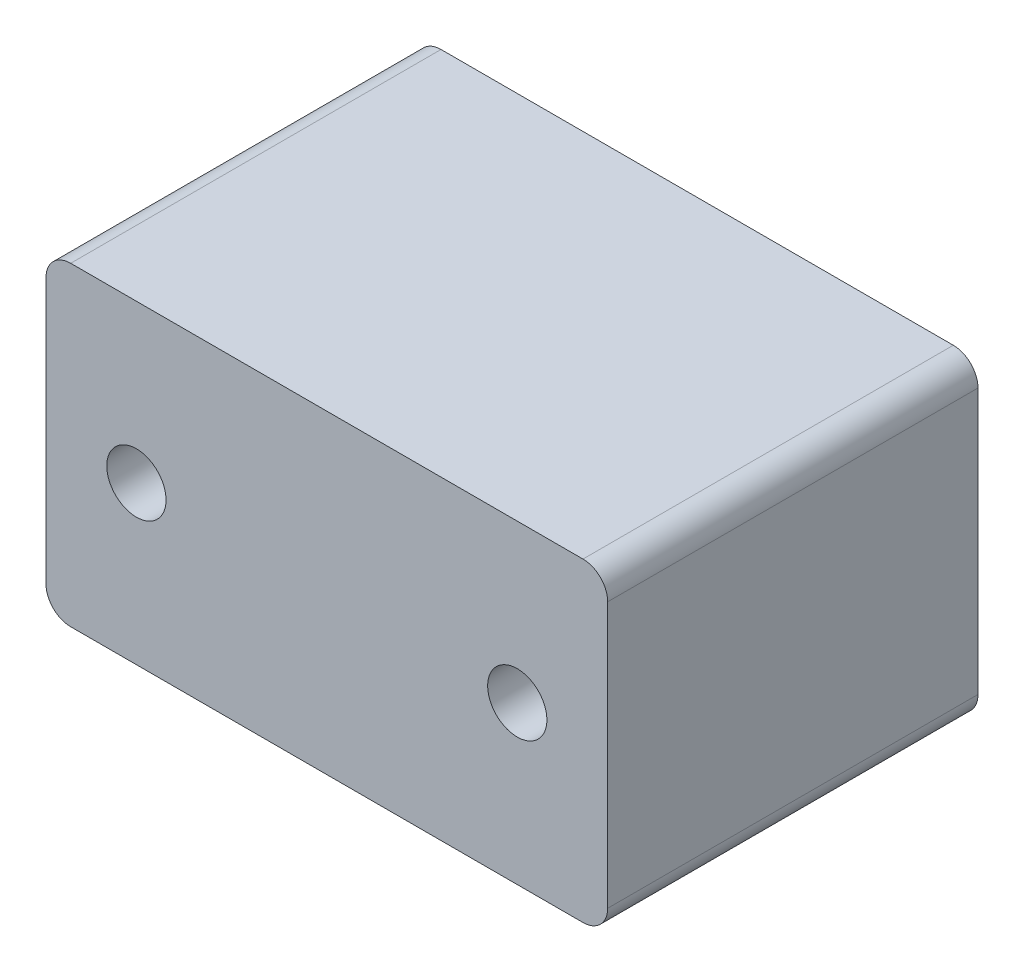
ISO-10303-21;
HEADER;
FILE_DESCRIPTION(('STEP AP214'),'2;1');
FILE_NAME('part.step','',(''),(''),'','','');
FILE_SCHEMA(('AUTOMOTIVE_DESIGN { 1 0 10303 214 1 1 1 1 }'));
ENDSEC;
DATA;
#1=APPLICATION_CONTEXT('core data for automotive mechanical design processes');
#2=APPLICATION_PROTOCOL_DEFINITION('international standard','automotive_design',2000,#1);
#3=PRODUCT_CONTEXT('',#1,'mechanical');
#4=PRODUCT('Part','Part','',(#3));
#5=PRODUCT_RELATED_PRODUCT_CATEGORY('part','',(#4));
#6=PRODUCT_DEFINITION_FORMATION('','',#4);
#7=PRODUCT_DEFINITION_CONTEXT('part definition',#1,'design');
#8=PRODUCT_DEFINITION('design','',#6,#7);
#9=PRODUCT_DEFINITION_SHAPE('','',#8);
#10=(LENGTH_UNIT() NAMED_UNIT(*) SI_UNIT(.MILLI.,.METRE.));
#11=(NAMED_UNIT(*) PLANE_ANGLE_UNIT() SI_UNIT($,.RADIAN.));
#12=(NAMED_UNIT(*) SI_UNIT($,.STERADIAN.) SOLID_ANGLE_UNIT());
#13=UNCERTAINTY_MEASURE_WITH_UNIT(LENGTH_MEASURE(1.E-05),#10,'distance_accuracy_value','');
#14=(GEOMETRIC_REPRESENTATION_CONTEXT(3) GLOBAL_UNCERTAINTY_ASSIGNED_CONTEXT((#13)) GLOBAL_UNIT_ASSIGNED_CONTEXT((#10,
#11,#12)) REPRESENTATION_CONTEXT('',''));
#15=CARTESIAN_POINT('',(0.,0.,0.));
#16=DIRECTION('',(0.,0.,1.));
#17=DIRECTION('',(1.,0.,0.));
#18=AXIS2_PLACEMENT_3D('',#15,#16,#17);
#19=CARTESIAN_POINT('',(0.,0.,15.));
#20=DIRECTION('',(0.,0.,1.));
#21=DIRECTION('',(1.,0.,0.));
#22=AXIS2_PLACEMENT_3D('',#19,#20,#21);
#23=PLANE('',#22);
#24=CARTESIAN_POINT('',(-15.4263698630137,0.,15.));
#25=DIRECTION('',(0.,0.,1.));
#26=DIRECTION('',(1.,0.,0.));
#27=AXIS2_PLACEMENT_3D('',#24,#25,#26);
#28=CIRCLE('',#27,2.4);
#29=CARTESIAN_POINT('',(-13.0263698630137,0.,15.));
#30=VERTEX_POINT('',#29);
#31=EDGE_CURVE('E147',#30,#30,#28,.T.);
#32=ORIENTED_EDGE('',*,*,#31,.F.);
#33=EDGE_LOOP('',(#32));
#34=FACE_BOUND('',#33,.T.);
#35=DIRECTION('',(0.,-1.,0.));
#36=VECTOR('',#35,1.);
#37=CARTESIAN_POINT('',(-22.75,-12.75,15.));
#38=LINE('',#37,#36);
#39=CARTESIAN_POINT('',(-22.75,10.75,15.));
#40=VERTEX_POINT('',#39);
#41=CARTESIAN_POINT('',(-22.75,-10.75,15.));
#42=VERTEX_POINT('',#41);
#43=EDGE_CURVE('E153',#40,#42,#38,.T.);
#44=ORIENTED_EDGE('',*,*,#43,.T.);
#45=CARTESIAN_POINT('',(-20.75,-10.75,15.));
#46=DIRECTION('',(0.,0.,1.));
#47=DIRECTION('',(1.,0.,0.));
#48=AXIS2_PLACEMENT_3D('',#45,#46,#47);
#49=CIRCLE('',#48,2.);
#50=CARTESIAN_POINT('',(-20.75,-12.75,15.));
#51=VERTEX_POINT('',#50);
#52=EDGE_CURVE('E177',#42,#51,#49,.T.);
#53=ORIENTED_EDGE('',*,*,#52,.T.);
#54=DIRECTION('',(1.,0.,0.));
#55=VECTOR('',#54,1.);
#56=CARTESIAN_POINT('',(22.75,-12.75,15.));
#57=LINE('',#56,#55);
#58=CARTESIAN_POINT('',(20.75,-12.75,15.));
#59=VERTEX_POINT('',#58);
#60=EDGE_CURVE('E130',#51,#59,#57,.T.);
#61=ORIENTED_EDGE('',*,*,#60,.T.);
#62=CARTESIAN_POINT('',(20.75,-10.75,15.));
#63=DIRECTION('',(0.,0.,1.));
#64=DIRECTION('',(1.,0.,0.));
#65=AXIS2_PLACEMENT_3D('',#62,#63,#64);
#66=CIRCLE('',#65,2.);
#67=CARTESIAN_POINT('',(22.75,-10.75,15.));
#68=VERTEX_POINT('',#67);
#69=EDGE_CURVE('E174',#59,#68,#66,.T.);
#70=ORIENTED_EDGE('',*,*,#69,.T.);
#71=DIRECTION('',(0.,1.,0.));
#72=VECTOR('',#71,1.);
#73=CARTESIAN_POINT('',(22.75,-12.75,15.));
#74=LINE('',#73,#72);
#75=CARTESIAN_POINT('',(22.75,10.75,15.));
#76=VERTEX_POINT('',#75);
#77=EDGE_CURVE('E203',#68,#76,#74,.T.);
#78=ORIENTED_EDGE('',*,*,#77,.T.);
#79=CARTESIAN_POINT('',(20.75,10.75,15.));
#80=DIRECTION('',(0.,0.,1.));
#81=DIRECTION('',(1.,0.,0.));
#82=AXIS2_PLACEMENT_3D('',#79,#80,#81);
#83=CIRCLE('',#82,2.);
#84=CARTESIAN_POINT('',(20.75,12.75,15.));
#85=VERTEX_POINT('',#84);
#86=EDGE_CURVE('E64',#76,#85,#83,.T.);
#87=ORIENTED_EDGE('',*,*,#86,.T.);
#88=DIRECTION('',(-1.,0.,0.));
#89=VECTOR('',#88,1.);
#90=CARTESIAN_POINT('',(22.75,12.75,15.));
#91=LINE('',#90,#89);
#92=CARTESIAN_POINT('',(-20.75,12.75,15.));
#93=VERTEX_POINT('',#92);
#94=EDGE_CURVE('E155',#85,#93,#91,.T.);
#95=ORIENTED_EDGE('',*,*,#94,.T.);
#96=CARTESIAN_POINT('',(-20.75,10.75,15.));
#97=DIRECTION('',(0.,0.,1.));
#98=DIRECTION('',(1.,0.,0.));
#99=AXIS2_PLACEMENT_3D('',#96,#97,#98);
#100=CIRCLE('',#99,2.);
#101=EDGE_CURVE('E171',#93,#40,#100,.T.);
#102=ORIENTED_EDGE('',*,*,#101,.T.);
#103=EDGE_LOOP('',(#44,#53,#61,#70,#78,#87,#95,#102));
#104=FACE_BOUND('',#103,.T.);
#105=CARTESIAN_POINT('',(15.4263698630137,0.,15.));
#106=DIRECTION('',(0.,0.,1.));
#107=DIRECTION('',(-1.,0.,0.));
#108=AXIS2_PLACEMENT_3D('',#105,#106,#107);
#109=CIRCLE('',#108,2.4);
#110=CARTESIAN_POINT('',(13.0263698630137,0.,15.));
#111=VERTEX_POINT('',#110);
#112=EDGE_CURVE('E217',#111,#111,#109,.T.);
#113=ORIENTED_EDGE('',*,*,#112,.F.);
#114=EDGE_LOOP('',(#113));
#115=FACE_BOUND('',#114,.T.);
#116=ADVANCED_FACE('F43',(#34,#104,#115),#23,.T.);
#117=CARTESIAN_POINT('',(0.,0.,-15.));
#118=DIRECTION('',(0.,0.,1.));
#119=DIRECTION('',(1.,0.,0.));
#120=AXIS2_PLACEMENT_3D('',#117,#118,#119);
#121=PLANE('',#120);
#122=DIRECTION('',(1.,0.,0.));
#123=VECTOR('',#122,1.);
#124=CARTESIAN_POINT('',(22.75,-12.75,-15.));
#125=LINE('',#124,#123);
#126=CARTESIAN_POINT('',(-20.75,-12.75,-15.));
#127=VERTEX_POINT('',#126);
#128=CARTESIAN_POINT('',(20.75,-12.75,-15.));
#129=VERTEX_POINT('',#128);
#130=EDGE_CURVE('E127',#127,#129,#125,.T.);
#131=ORIENTED_EDGE('',*,*,#130,.F.);
#132=CARTESIAN_POINT('',(-20.75,-10.75,-15.));
#133=DIRECTION('',(0.,0.,1.));
#134=DIRECTION('',(1.,0.,0.));
#135=AXIS2_PLACEMENT_3D('',#132,#133,#134);
#136=CIRCLE('',#135,2.);
#137=CARTESIAN_POINT('',(-22.75,-10.75,-15.));
#138=VERTEX_POINT('',#137);
#139=EDGE_CURVE('E109',#127,#138,#136,.F.);
#140=ORIENTED_EDGE('',*,*,#139,.T.);
#141=DIRECTION('',(0.,-1.,0.));
#142=VECTOR('',#141,1.);
#143=CARTESIAN_POINT('',(-22.75,-12.75,-15.));
#144=LINE('',#143,#142);
#145=CARTESIAN_POINT('',(-22.75,10.75,-15.));
#146=VERTEX_POINT('',#145);
#147=EDGE_CURVE('E140',#146,#138,#144,.T.);
#148=ORIENTED_EDGE('',*,*,#147,.F.);
#149=CARTESIAN_POINT('',(-20.75,10.75,-15.));
#150=DIRECTION('',(0.,0.,1.));
#151=DIRECTION('',(1.,0.,0.));
#152=AXIS2_PLACEMENT_3D('',#149,#150,#151);
#153=CIRCLE('',#152,2.);
#154=CARTESIAN_POINT('',(-20.75,12.75,-15.));
#155=VERTEX_POINT('',#154);
#156=EDGE_CURVE('E159',#146,#155,#153,.F.);
#157=ORIENTED_EDGE('',*,*,#156,.T.);
#158=DIRECTION('',(-1.,0.,0.));
#159=VECTOR('',#158,1.);
#160=CARTESIAN_POINT('',(22.75,12.75,-15.));
#161=LINE('',#160,#159);
#162=CARTESIAN_POINT('',(20.75,12.75,-15.));
#163=VERTEX_POINT('',#162);
#164=EDGE_CURVE('E145',#163,#155,#161,.T.);
#165=ORIENTED_EDGE('',*,*,#164,.F.);
#166=CARTESIAN_POINT('',(20.75,10.75,-15.));
#167=DIRECTION('',(0.,0.,1.));
#168=DIRECTION('',(1.,0.,0.));
#169=AXIS2_PLACEMENT_3D('',#166,#167,#168);
#170=CIRCLE('',#169,2.);
#171=CARTESIAN_POINT('',(22.75,10.75,-15.));
#172=VERTEX_POINT('',#171);
#173=EDGE_CURVE('E132',#163,#172,#170,.F.);
#174=ORIENTED_EDGE('',*,*,#173,.T.);
#175=DIRECTION('',(0.,1.,0.));
#176=VECTOR('',#175,1.);
#177=CARTESIAN_POINT('',(22.75,-12.75,-15.));
#178=LINE('',#177,#176);
#179=CARTESIAN_POINT('',(22.75,-10.75,-15.));
#180=VERTEX_POINT('',#179);
#181=EDGE_CURVE('E139',#180,#172,#178,.T.);
#182=ORIENTED_EDGE('',*,*,#181,.F.);
#183=CARTESIAN_POINT('',(20.75,-10.75,-15.));
#184=DIRECTION('',(0.,0.,1.));
#185=DIRECTION('',(1.,0.,0.));
#186=AXIS2_PLACEMENT_3D('',#183,#184,#185);
#187=CIRCLE('',#186,2.);
#188=EDGE_CURVE('E121',#180,#129,#187,.F.);
#189=ORIENTED_EDGE('',*,*,#188,.T.);
#190=EDGE_LOOP('',(#131,#140,#148,#157,#165,#174,#182,#189));
#191=FACE_BOUND('',#190,.T.);
#192=CARTESIAN_POINT('',(-15.4263698630137,0.,-15.));
#193=DIRECTION('',(0.,0.,1.));
#194=DIRECTION('',(1.,0.,0.));
#195=AXIS2_PLACEMENT_3D('',#192,#193,#194);
#196=CIRCLE('',#195,2.4);
#197=CARTESIAN_POINT('',(-13.0263698630137,0.,-15.));
#198=VERTEX_POINT('',#197);
#199=EDGE_CURVE('E206',#198,#198,#196,.T.);
#200=ORIENTED_EDGE('',*,*,#199,.T.);
#201=EDGE_LOOP('',(#200));
#202=FACE_BOUND('',#201,.T.);
#203=CARTESIAN_POINT('',(15.4263698630137,0.,-15.));
#204=DIRECTION('',(0.,0.,1.));
#205=DIRECTION('',(-1.,0.,0.));
#206=AXIS2_PLACEMENT_3D('',#203,#204,#205);
#207=CIRCLE('',#206,2.4);
#208=CARTESIAN_POINT('',(13.0263698630137,0.,-15.));
#209=VERTEX_POINT('',#208);
#210=EDGE_CURVE('E220',#209,#209,#207,.T.);
#211=ORIENTED_EDGE('',*,*,#210,.T.);
#212=EDGE_LOOP('',(#211));
#213=FACE_BOUND('',#212,.T.);
#214=ADVANCED_FACE('F135',(#191,#202,#213),#121,.F.);
#215=CARTESIAN_POINT('',(-22.75,-12.75,15.));
#216=DIRECTION('',(1.,0.,0.));
#217=DIRECTION('',(0.,0.,-1.));
#218=AXIS2_PLACEMENT_3D('',#215,#216,#217);
#219=PLANE('',#218);
#220=ORIENTED_EDGE('',*,*,#147,.T.);
#221=DIRECTION('',(0.,0.,-1.));
#222=VECTOR('',#221,1.);
#223=CARTESIAN_POINT('',(-22.75,-10.75,15.));
#224=LINE('',#223,#222);
#225=EDGE_CURVE('E114',#138,#42,#224,.F.);
#226=ORIENTED_EDGE('',*,*,#225,.T.);
#227=ORIENTED_EDGE('',*,*,#43,.F.);
#228=DIRECTION('',(0.,0.,-1.));
#229=VECTOR('',#228,1.);
#230=CARTESIAN_POINT('',(-22.75,10.75,15.));
#231=LINE('',#230,#229);
#232=EDGE_CURVE('E120',#40,#146,#231,.T.);
#233=ORIENTED_EDGE('',*,*,#232,.T.);
#234=EDGE_LOOP('',(#220,#226,#227,#233));
#235=FACE_BOUND('',#234,.T.);
#236=ADVANCED_FACE('F198',(#235),#219,.F.);
#237=CARTESIAN_POINT('',(22.75,-12.75,15.));
#238=DIRECTION('',(0.,1.,0.));
#239=DIRECTION('',(-1.,0.,0.));
#240=AXIS2_PLACEMENT_3D('',#237,#238,#239);
#241=PLANE('',#240);
#242=ORIENTED_EDGE('',*,*,#60,.F.);
#243=DIRECTION('',(0.,0.,-1.));
#244=VECTOR('',#243,1.);
#245=CARTESIAN_POINT('',(-20.75,-12.75,15.));
#246=LINE('',#245,#244);
#247=EDGE_CURVE('E113',#51,#127,#246,.T.);
#248=ORIENTED_EDGE('',*,*,#247,.T.);
#249=ORIENTED_EDGE('',*,*,#130,.T.);
#250=DIRECTION('',(0.,0.,-1.));
#251=VECTOR('',#250,1.);
#252=CARTESIAN_POINT('',(20.75,-12.75,15.));
#253=LINE('',#252,#251);
#254=EDGE_CURVE('E133',#129,#59,#253,.F.);
#255=ORIENTED_EDGE('',*,*,#254,.T.);
#256=EDGE_LOOP('',(#242,#248,#249,#255));
#257=FACE_BOUND('',#256,.T.);
#258=ADVANCED_FACE('F126',(#257),#241,.F.);
#259=CARTESIAN_POINT('',(22.75,-12.75,15.));
#260=DIRECTION('',(-1.,0.,0.));
#261=DIRECTION('',(0.,0.,1.));
#262=AXIS2_PLACEMENT_3D('',#259,#260,#261);
#263=PLANE('',#262);
#264=ORIENTED_EDGE('',*,*,#77,.F.);
#265=DIRECTION('',(0.,0.,-1.));
#266=VECTOR('',#265,1.);
#267=CARTESIAN_POINT('',(22.75,-10.75,15.));
#268=LINE('',#267,#266);
#269=EDGE_CURVE('E183',#68,#180,#268,.T.);
#270=ORIENTED_EDGE('',*,*,#269,.T.);
#271=ORIENTED_EDGE('',*,*,#181,.T.);
#272=DIRECTION('',(0.,0.,-1.));
#273=VECTOR('',#272,1.);
#274=CARTESIAN_POINT('',(22.75,10.75,15.));
#275=LINE('',#274,#273);
#276=EDGE_CURVE('E180',#172,#76,#275,.F.);
#277=ORIENTED_EDGE('',*,*,#276,.T.);
#278=EDGE_LOOP('',(#264,#270,#271,#277));
#279=FACE_BOUND('',#278,.T.);
#280=ADVANCED_FACE('F252',(#279),#263,.F.);
#281=CARTESIAN_POINT('',(22.75,12.75,15.));
#282=DIRECTION('',(0.,-1.,0.));
#283=DIRECTION('',(1.,0.,0.));
#284=AXIS2_PLACEMENT_3D('',#281,#282,#283);
#285=PLANE('',#284);
#286=ORIENTED_EDGE('',*,*,#164,.T.);
#287=DIRECTION('',(0.,0.,-1.));
#288=VECTOR('',#287,1.);
#289=CARTESIAN_POINT('',(-20.75,12.75,15.));
#290=LINE('',#289,#288);
#291=EDGE_CURVE('E11',#155,#93,#290,.F.);
#292=ORIENTED_EDGE('',*,*,#291,.T.);
#293=ORIENTED_EDGE('',*,*,#94,.F.);
#294=DIRECTION('',(0.,0.,-1.));
#295=VECTOR('',#294,1.);
#296=CARTESIAN_POINT('',(20.75,12.75,15.));
#297=LINE('',#296,#295);
#298=EDGE_CURVE('E52',#85,#163,#297,.T.);
#299=ORIENTED_EDGE('',*,*,#298,.T.);
#300=EDGE_LOOP('',(#286,#292,#293,#299));
#301=FACE_BOUND('',#300,.T.);
#302=ADVANCED_FACE('F190',(#301),#285,.F.);
#303=CARTESIAN_POINT('',(-15.4263698630137,0.,15.));
#304=DIRECTION('',(0.,0.,-1.));
#305=DIRECTION('',(-1.,0.,0.));
#306=AXIS2_PLACEMENT_3D('',#303,#304,#305);
#307=CYLINDRICAL_SURFACE('',#306,2.4);
#308=ORIENTED_EDGE('',*,*,#31,.T.);
#309=EDGE_LOOP('',(#308));
#310=FACE_BOUND('',#309,.T.);
#311=ORIENTED_EDGE('',*,*,#199,.F.);
#312=EDGE_LOOP('',(#311));
#313=FACE_BOUND('',#312,.T.);
#314=ADVANCED_FACE('F231',(#310,#313),#307,.F.);
#315=CARTESIAN_POINT('',(15.4263698630137,0.,15.));
#316=DIRECTION('',(0.,0.,-1.));
#317=DIRECTION('',(-1.,0.,0.));
#318=AXIS2_PLACEMENT_3D('',#315,#316,#317);
#319=CYLINDRICAL_SURFACE('',#318,2.4);
#320=ORIENTED_EDGE('',*,*,#112,.T.);
#321=EDGE_LOOP('',(#320));
#322=FACE_BOUND('',#321,.T.);
#323=ORIENTED_EDGE('',*,*,#210,.F.);
#324=EDGE_LOOP('',(#323));
#325=FACE_BOUND('',#324,.T.);
#326=ADVANCED_FACE('F234',(#322,#325),#319,.F.);
#327=CARTESIAN_POINT('',(-20.75,-10.75,15.));
#328=DIRECTION('',(0.,0.,-1.));
#329=DIRECTION('',(-1.,0.,0.));
#330=AXIS2_PLACEMENT_3D('',#327,#328,#329);
#331=CYLINDRICAL_SURFACE('',#330,2.);
#332=ORIENTED_EDGE('',*,*,#52,.F.);
#333=ORIENTED_EDGE('',*,*,#225,.F.);
#334=ORIENTED_EDGE('',*,*,#139,.F.);
#335=ORIENTED_EDGE('',*,*,#247,.F.);
#336=EDGE_LOOP('',(#332,#333,#334,#335));
#337=FACE_BOUND('',#336,.T.);
#338=ADVANCED_FACE('F112',(#337),#331,.T.);
#339=CARTESIAN_POINT('',(20.75,-10.75,15.));
#340=DIRECTION('',(0.,0.,-1.));
#341=DIRECTION('',(-1.,0.,0.));
#342=AXIS2_PLACEMENT_3D('',#339,#340,#341);
#343=CYLINDRICAL_SURFACE('',#342,2.);
#344=ORIENTED_EDGE('',*,*,#69,.F.);
#345=ORIENTED_EDGE('',*,*,#254,.F.);
#346=ORIENTED_EDGE('',*,*,#188,.F.);
#347=ORIENTED_EDGE('',*,*,#269,.F.);
#348=EDGE_LOOP('',(#344,#345,#346,#347));
#349=FACE_BOUND('',#348,.T.);
#350=ADVANCED_FACE('F247',(#349),#343,.T.);
#351=CARTESIAN_POINT('',(-20.75,10.75,15.));
#352=DIRECTION('',(0.,0.,-1.));
#353=DIRECTION('',(-1.,0.,0.));
#354=AXIS2_PLACEMENT_3D('',#351,#352,#353);
#355=CYLINDRICAL_SURFACE('',#354,2.);
#356=ORIENTED_EDGE('',*,*,#101,.F.);
#357=ORIENTED_EDGE('',*,*,#291,.F.);
#358=ORIENTED_EDGE('',*,*,#156,.F.);
#359=ORIENTED_EDGE('',*,*,#232,.F.);
#360=EDGE_LOOP('',(#356,#357,#358,#359));
#361=FACE_BOUND('',#360,.T.);
#362=ADVANCED_FACE('F195',(#361),#355,.T.);
#363=CARTESIAN_POINT('',(20.75,10.75,15.));
#364=DIRECTION('',(0.,0.,-1.));
#365=DIRECTION('',(-1.,0.,0.));
#366=AXIS2_PLACEMENT_3D('',#363,#364,#365);
#367=CYLINDRICAL_SURFACE('',#366,2.);
#368=ORIENTED_EDGE('',*,*,#86,.F.);
#369=ORIENTED_EDGE('',*,*,#276,.F.);
#370=ORIENTED_EDGE('',*,*,#173,.F.);
#371=ORIENTED_EDGE('',*,*,#298,.F.);
#372=EDGE_LOOP('',(#368,#369,#370,#371));
#373=FACE_BOUND('',#372,.T.);
#374=ADVANCED_FACE('F45',(#373),#367,.T.);
#375=CLOSED_SHELL('',(#116,#214,#236,#258,#280,#302,#314,#326,#338,#350,#362,#374));
#376=MANIFOLD_SOLID_BREP('B2',#375);
#377=ADVANCED_BREP_SHAPE_REPRESENTATION('',(#18,#376),#14);
#378=SHAPE_DEFINITION_REPRESENTATION(#9,#377);
ENDSEC;
END-ISO-10303-21;
